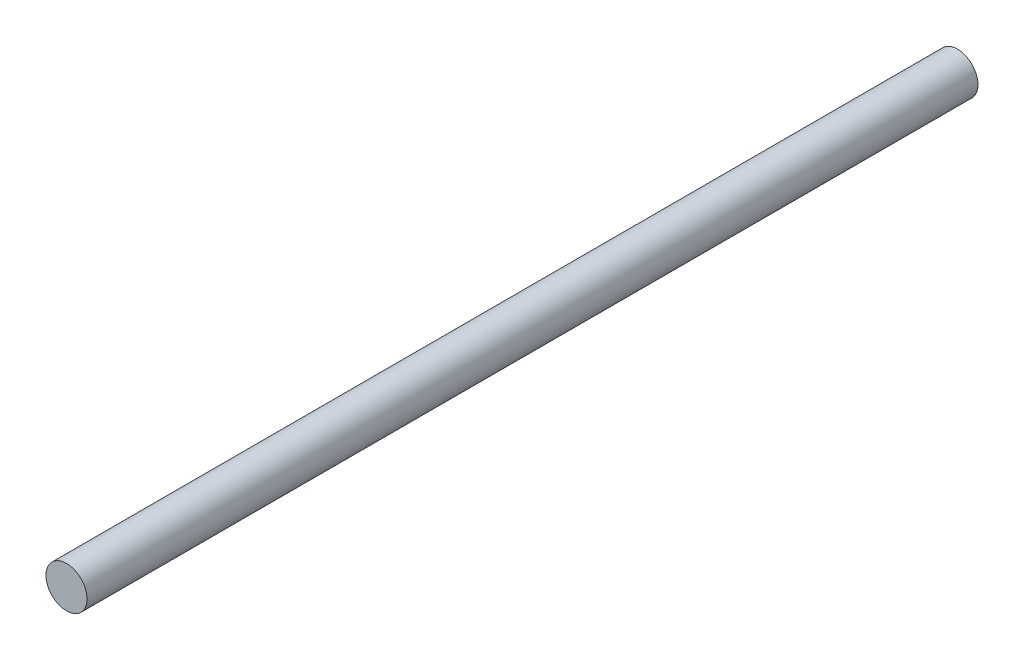
ISO-10303-21;
HEADER;
FILE_DESCRIPTION(('STEP AP214'),'2;1');
FILE_NAME('part.step','',(''),(''),'','','');
FILE_SCHEMA(('AUTOMOTIVE_DESIGN { 1 0 10303 214 1 1 1 1 }'));
ENDSEC;
DATA;
#1=APPLICATION_CONTEXT('core data for automotive mechanical design processes');
#2=APPLICATION_PROTOCOL_DEFINITION('international standard','automotive_design',2000,#1);
#3=PRODUCT_CONTEXT('',#1,'mechanical');
#4=PRODUCT('Part','Part','',(#3));
#5=PRODUCT_RELATED_PRODUCT_CATEGORY('part','',(#4));
#6=PRODUCT_DEFINITION_FORMATION('','',#4);
#7=PRODUCT_DEFINITION_CONTEXT('part definition',#1,'design');
#8=PRODUCT_DEFINITION('design','',#6,#7);
#9=PRODUCT_DEFINITION_SHAPE('','',#8);
#10=(LENGTH_UNIT() NAMED_UNIT(*) SI_UNIT(.MILLI.,.METRE.));
#11=(NAMED_UNIT(*) PLANE_ANGLE_UNIT() SI_UNIT($,.RADIAN.));
#12=(NAMED_UNIT(*) SI_UNIT($,.STERADIAN.) SOLID_ANGLE_UNIT());
#13=UNCERTAINTY_MEASURE_WITH_UNIT(LENGTH_MEASURE(1.E-05),#10,'distance_accuracy_value','');
#14=(GEOMETRIC_REPRESENTATION_CONTEXT(3) GLOBAL_UNCERTAINTY_ASSIGNED_CONTEXT((#13)) GLOBAL_UNIT_ASSIGNED_CONTEXT((#10,
#11,#12)) REPRESENTATION_CONTEXT('',''));
#15=CARTESIAN_POINT('',(0.,0.,0.));
#16=DIRECTION('',(0.,0.,1.));
#17=DIRECTION('',(1.,0.,0.));
#18=AXIS2_PLACEMENT_3D('',#15,#16,#17);
#19=CARTESIAN_POINT('',(0.,0.,65.));
#20=DIRECTION('',(0.,0.,-1.));
#21=DIRECTION('',(-1.,0.,0.));
#22=AXIS2_PLACEMENT_3D('',#19,#20,#21);
#23=CYLINDRICAL_SURFACE('',#22,1.5);
#24=CARTESIAN_POINT('',(0.,0.,65.));
#25=DIRECTION('',(0.,0.,1.));
#26=DIRECTION('',(1.,0.,0.));
#27=AXIS2_PLACEMENT_3D('',#24,#25,#26);
#28=CIRCLE('',#27,1.5);
#29=CARTESIAN_POINT('',(1.5,0.,65.));
#30=VERTEX_POINT('',#29);
#31=EDGE_CURVE('E10',#30,#30,#28,.T.);
#32=ORIENTED_EDGE('',*,*,#31,.F.);
#33=EDGE_LOOP('',(#32));
#34=FACE_BOUND('',#33,.T.);
#35=CARTESIAN_POINT('',(0.,0.,0.));
#36=DIRECTION('',(0.,0.,1.));
#37=DIRECTION('',(1.,0.,0.));
#38=AXIS2_PLACEMENT_3D('',#35,#36,#37);
#39=CIRCLE('',#38,1.5);
#40=CARTESIAN_POINT('',(1.5,0.,0.));
#41=VERTEX_POINT('',#40);
#42=EDGE_CURVE('E35',#41,#41,#39,.T.);
#43=ORIENTED_EDGE('',*,*,#42,.T.);
#44=EDGE_LOOP('',(#43));
#45=FACE_BOUND('',#44,.T.);
#46=ADVANCED_FACE('F32',(#34,#45),#23,.T.);
#47=CARTESIAN_POINT('',(0.,0.,65.));
#48=DIRECTION('',(0.,0.,1.));
#49=DIRECTION('',(1.,0.,0.));
#50=AXIS2_PLACEMENT_3D('',#47,#48,#49);
#51=PLANE('',#50);
#52=ORIENTED_EDGE('',*,*,#31,.T.);
#53=EDGE_LOOP('',(#52));
#54=FACE_BOUND('',#53,.T.);
#55=ADVANCED_FACE('F47',(#54),#51,.T.);
#56=CARTESIAN_POINT('',(0.,0.,0.));
#57=DIRECTION('',(0.,0.,1.));
#58=DIRECTION('',(1.,0.,0.));
#59=AXIS2_PLACEMENT_3D('',#56,#57,#58);
#60=PLANE('',#59);
#61=ORIENTED_EDGE('',*,*,#42,.F.);
#62=EDGE_LOOP('',(#61));
#63=FACE_BOUND('',#62,.T.);
#64=ADVANCED_FACE('F45',(#63),#60,.F.);
#65=CLOSED_SHELL('',(#46,#55,#64));
#66=MANIFOLD_SOLID_BREP('B2',#65);
#67=ADVANCED_BREP_SHAPE_REPRESENTATION('',(#18,#66),#14);
#68=SHAPE_DEFINITION_REPRESENTATION(#9,#67);
ENDSEC;
END-ISO-10303-21;
